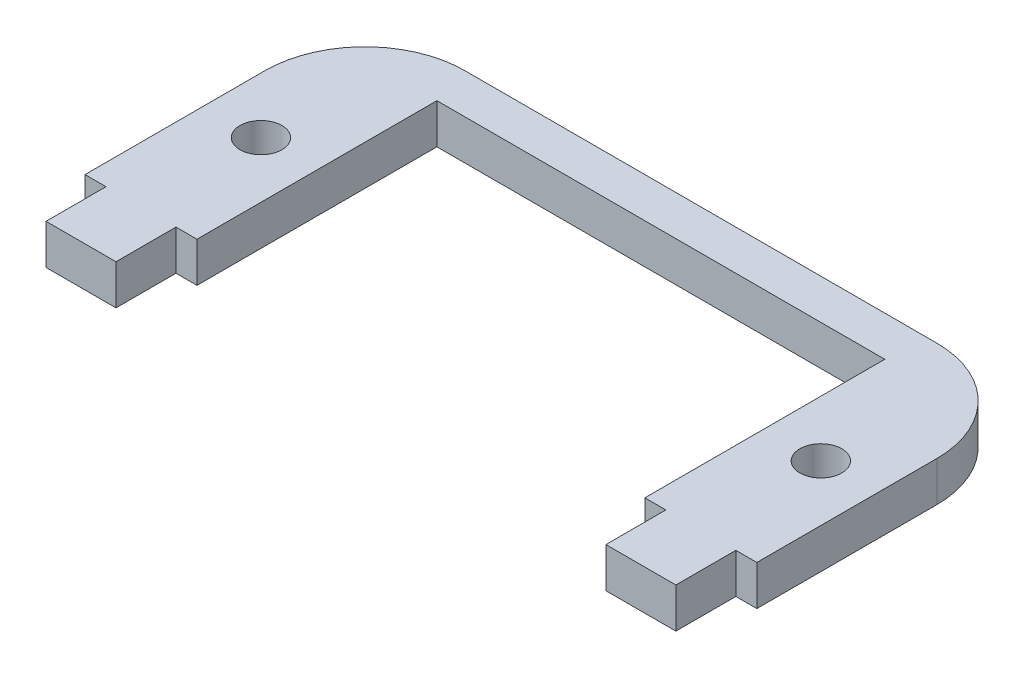
ISO-10303-21;
HEADER;
FILE_DESCRIPTION(('STEP AP214'),'2;1');
FILE_NAME('part.step','',(''),(''),'','','');
FILE_SCHEMA(('AUTOMOTIVE_DESIGN { 1 0 10303 214 1 1 1 1 }'));
ENDSEC;
DATA;
#1=APPLICATION_CONTEXT('core data for automotive mechanical design processes');
#2=APPLICATION_PROTOCOL_DEFINITION('international standard','automotive_design',2000,#1);
#3=PRODUCT_CONTEXT('',#1,'mechanical');
#4=PRODUCT('Part','Part','',(#3));
#5=PRODUCT_RELATED_PRODUCT_CATEGORY('part','',(#4));
#6=PRODUCT_DEFINITION_FORMATION('','',#4);
#7=PRODUCT_DEFINITION_CONTEXT('part definition',#1,'design');
#8=PRODUCT_DEFINITION('design','',#6,#7);
#9=PRODUCT_DEFINITION_SHAPE('','',#8);
#10=(LENGTH_UNIT() NAMED_UNIT(*) SI_UNIT(.MILLI.,.METRE.));
#11=(NAMED_UNIT(*) PLANE_ANGLE_UNIT() SI_UNIT($,.RADIAN.));
#12=(NAMED_UNIT(*) SI_UNIT($,.STERADIAN.) SOLID_ANGLE_UNIT());
#13=UNCERTAINTY_MEASURE_WITH_UNIT(LENGTH_MEASURE(1.E-05),#10,'distance_accuracy_value','');
#14=(GEOMETRIC_REPRESENTATION_CONTEXT(3) GLOBAL_UNCERTAINTY_ASSIGNED_CONTEXT((#13)) GLOBAL_UNIT_ASSIGNED_CONTEXT((#10,
#11,#12)) REPRESENTATION_CONTEXT('',''));
#15=CARTESIAN_POINT('',(0.,0.,0.));
#16=DIRECTION('',(0.,0.,1.));
#17=DIRECTION('',(1.,0.,0.));
#18=AXIS2_PLACEMENT_3D('',#15,#16,#17);
#19=CARTESIAN_POINT('',(16.8,2.,0.));
#20=DIRECTION('',(1.,0.,0.));
#21=DIRECTION('',(0.,0.,-1.));
#22=AXIS2_PLACEMENT_3D('',#19,#20,#21);
#23=PLANE('',#22);
#24=DIRECTION('',(0.,0.,1.));
#25=VECTOR('',#24,1.);
#26=CARTESIAN_POINT('',(16.8,0.,0.));
#27=LINE('',#26,#25);
#28=CARTESIAN_POINT('',(16.8,0.,-8.99999999999996));
#29=VERTEX_POINT('',#28);
#30=CARTESIAN_POINT('',(16.8,0.,0.));
#31=VERTEX_POINT('',#30);
#32=EDGE_CURVE('E195',#29,#31,#27,.T.);
#33=ORIENTED_EDGE('',*,*,#32,.F.);
#34=DIRECTION('',(0.,-1.,0.));
#35=VECTOR('',#34,1.);
#36=CARTESIAN_POINT('',(16.8,2.,-8.99999999999996));
#37=LINE('',#36,#35);
#38=CARTESIAN_POINT('',(16.8,2.,-8.99999999999996));
#39=VERTEX_POINT('',#38);
#40=EDGE_CURVE('E11',#39,#29,#37,.T.);
#41=ORIENTED_EDGE('',*,*,#40,.F.);
#42=DIRECTION('',(0.,0.,1.));
#43=VECTOR('',#42,1.);
#44=CARTESIAN_POINT('',(16.8,2.,0.));
#45=LINE('',#44,#43);
#46=CARTESIAN_POINT('',(16.8,2.,0.));
#47=VERTEX_POINT('',#46);
#48=EDGE_CURVE('E305',#39,#47,#45,.T.);
#49=ORIENTED_EDGE('',*,*,#48,.T.);
#50=DIRECTION('',(0.,-1.,0.));
#51=VECTOR('',#50,1.);
#52=CARTESIAN_POINT('',(16.8,2.,0.));
#53=LINE('',#52,#51);
#54=EDGE_CURVE('E51',#47,#31,#53,.T.);
#55=ORIENTED_EDGE('',*,*,#54,.T.);
#56=EDGE_LOOP('',(#33,#41,#49,#55));
#57=FACE_BOUND('',#56,.T.);
#58=ADVANCED_FACE('F34',(#57),#23,.T.);
#59=CARTESIAN_POINT('',(11.8,2.,-9.));
#60=DIRECTION('',(0.,-1.,0.));
#61=DIRECTION('',(0.,0.,-1.));
#62=AXIS2_PLACEMENT_3D('',#59,#60,#61);
#63=CYLINDRICAL_SURFACE('',#62,5.);
#64=CARTESIAN_POINT('',(11.8,0.,-9.));
#65=DIRECTION('',(0.,1.,0.));
#66=DIRECTION('',(0.,0.,1.));
#67=AXIS2_PLACEMENT_3D('',#64,#65,#66);
#68=CIRCLE('',#67,5.);
#69=CARTESIAN_POINT('',(11.8,0.,-14.));
#70=VERTEX_POINT('',#69);
#71=EDGE_CURVE('E197',#29,#70,#68,.T.);
#72=ORIENTED_EDGE('',*,*,#71,.T.);
#73=DIRECTION('',(0.,-1.,0.));
#74=VECTOR('',#73,1.);
#75=CARTESIAN_POINT('',(11.8,2.,-14.));
#76=LINE('',#75,#74);
#77=CARTESIAN_POINT('',(11.8,2.,-14.));
#78=VERTEX_POINT('',#77);
#79=EDGE_CURVE('E43',#78,#70,#76,.T.);
#80=ORIENTED_EDGE('',*,*,#79,.F.);
#81=CARTESIAN_POINT('',(11.8,2.,-9.));
#82=DIRECTION('',(0.,1.,0.));
#83=DIRECTION('',(0.,0.,1.));
#84=AXIS2_PLACEMENT_3D('',#81,#82,#83);
#85=CIRCLE('',#84,5.);
#86=EDGE_CURVE('E301',#39,#78,#85,.T.);
#87=ORIENTED_EDGE('',*,*,#86,.F.);
#88=ORIENTED_EDGE('',*,*,#40,.T.);
#89=EDGE_LOOP('',(#72,#80,#87,#88));
#90=FACE_BOUND('',#89,.T.);
#91=ADVANCED_FACE('F288',(#90),#63,.T.);
#92=CARTESIAN_POINT('',(0.,2.,-14.));
#93=DIRECTION('',(0.,0.,-1.));
#94=DIRECTION('',(-1.,0.,0.));
#95=AXIS2_PLACEMENT_3D('',#92,#93,#94);
#96=PLANE('',#95);
#97=DIRECTION('',(1.,0.,0.));
#98=VECTOR('',#97,1.);
#99=CARTESIAN_POINT('',(0.,0.,-14.));
#100=LINE('',#99,#98);
#101=CARTESIAN_POINT('',(-11.8,0.,-14.));
#102=VERTEX_POINT('',#101);
#103=EDGE_CURVE('E200',#102,#70,#100,.T.);
#104=ORIENTED_EDGE('',*,*,#103,.F.);
#105=DIRECTION('',(0.,-1.,0.));
#106=VECTOR('',#105,1.);
#107=CARTESIAN_POINT('',(-11.8,2.,-14.));
#108=LINE('',#107,#106);
#109=CARTESIAN_POINT('',(-11.8,2.,-14.));
#110=VERTEX_POINT('',#109);
#111=EDGE_CURVE('E278',#110,#102,#108,.T.);
#112=ORIENTED_EDGE('',*,*,#111,.F.);
#113=DIRECTION('',(1.,0.,0.));
#114=VECTOR('',#113,1.);
#115=CARTESIAN_POINT('',(0.,2.,-14.));
#116=LINE('',#115,#114);
#117=EDGE_CURVE('E285',#110,#78,#116,.T.);
#118=ORIENTED_EDGE('',*,*,#117,.T.);
#119=ORIENTED_EDGE('',*,*,#79,.T.);
#120=EDGE_LOOP('',(#104,#112,#118,#119));
#121=FACE_BOUND('',#120,.T.);
#122=ADVANCED_FACE('F283',(#121),#96,.T.);
#123=CARTESIAN_POINT('',(-11.8,2.,-9.));
#124=DIRECTION('',(0.,-1.,0.));
#125=DIRECTION('',(0.,0.,-1.));
#126=AXIS2_PLACEMENT_3D('',#123,#124,#125);
#127=CYLINDRICAL_SURFACE('',#126,5.);
#128=CARTESIAN_POINT('',(-11.8,0.,-9.));
#129=DIRECTION('',(0.,1.,0.));
#130=DIRECTION('',(0.,0.,1.));
#131=AXIS2_PLACEMENT_3D('',#128,#129,#130);
#132=CIRCLE('',#131,5.);
#133=CARTESIAN_POINT('',(-16.8,0.,-8.99999999999996));
#134=VERTEX_POINT('',#133);
#135=EDGE_CURVE('E203',#134,#102,#132,.F.);
#136=ORIENTED_EDGE('',*,*,#135,.F.);
#137=DIRECTION('',(0.,-1.,0.));
#138=VECTOR('',#137,1.);
#139=CARTESIAN_POINT('',(-16.8,2.,-8.99999999999996));
#140=LINE('',#139,#138);
#141=CARTESIAN_POINT('',(-16.8,2.,-8.99999999999996));
#142=VERTEX_POINT('',#141);
#143=EDGE_CURVE('E276',#142,#134,#140,.T.);
#144=ORIENTED_EDGE('',*,*,#143,.F.);
#145=CARTESIAN_POINT('',(-11.8,2.,-9.));
#146=DIRECTION('',(0.,1.,0.));
#147=DIRECTION('',(0.,0.,1.));
#148=AXIS2_PLACEMENT_3D('',#145,#146,#147);
#149=CIRCLE('',#148,5.);
#150=EDGE_CURVE('E298',#142,#110,#149,.F.);
#151=ORIENTED_EDGE('',*,*,#150,.T.);
#152=ORIENTED_EDGE('',*,*,#111,.T.);
#153=EDGE_LOOP('',(#136,#144,#151,#152));
#154=FACE_BOUND('',#153,.T.);
#155=ADVANCED_FACE('F295',(#154),#127,.T.);
#156=CARTESIAN_POINT('',(-16.8,2.,0.));
#157=DIRECTION('',(-1.,0.,0.));
#158=DIRECTION('',(0.,0.,1.));
#159=AXIS2_PLACEMENT_3D('',#156,#157,#158);
#160=PLANE('',#159);
#161=DIRECTION('',(0.,0.,-1.));
#162=VECTOR('',#161,1.);
#163=CARTESIAN_POINT('',(-16.8,0.,0.));
#164=LINE('',#163,#162);
#165=CARTESIAN_POINT('',(-16.8,0.,0.));
#166=VERTEX_POINT('',#165);
#167=EDGE_CURVE('E206',#166,#134,#164,.T.);
#168=ORIENTED_EDGE('',*,*,#167,.F.);
#169=DIRECTION('',(0.,-1.,0.));
#170=VECTOR('',#169,1.);
#171=CARTESIAN_POINT('',(-16.8,2.,0.));
#172=LINE('',#171,#170);
#173=CARTESIAN_POINT('',(-16.8,2.,0.));
#174=VERTEX_POINT('',#173);
#175=EDGE_CURVE('E274',#174,#166,#172,.T.);
#176=ORIENTED_EDGE('',*,*,#175,.F.);
#177=DIRECTION('',(0.,0.,-1.));
#178=VECTOR('',#177,1.);
#179=CARTESIAN_POINT('',(-16.8,2.,0.));
#180=LINE('',#179,#178);
#181=EDGE_CURVE('E303',#174,#142,#180,.T.);
#182=ORIENTED_EDGE('',*,*,#181,.T.);
#183=ORIENTED_EDGE('',*,*,#143,.T.);
#184=EDGE_LOOP('',(#168,#176,#182,#183));
#185=FACE_BOUND('',#184,.T.);
#186=ADVANCED_FACE('F506',(#185),#160,.T.);
#187=CARTESIAN_POINT('',(0.,2.,0.));
#188=DIRECTION('',(0.,0.,-1.));
#189=DIRECTION('',(-1.,0.,0.));
#190=AXIS2_PLACEMENT_3D('',#187,#188,#189);
#191=PLANE('',#190);
#192=DIRECTION('',(1.,0.,0.));
#193=VECTOR('',#192,1.);
#194=CARTESIAN_POINT('',(0.,0.,0.));
#195=LINE('',#194,#193);
#196=CARTESIAN_POINT('',(-15.75,0.,0.));
#197=VERTEX_POINT('',#196);
#198=EDGE_CURVE('E209',#166,#197,#195,.T.);
#199=ORIENTED_EDGE('',*,*,#198,.T.);
#200=DIRECTION('',(0.,-1.,0.));
#201=VECTOR('',#200,1.);
#202=CARTESIAN_POINT('',(-15.75,2.,0.));
#203=LINE('',#202,#201);
#204=CARTESIAN_POINT('',(-15.75,2.,0.));
#205=VERTEX_POINT('',#204);
#206=EDGE_CURVE('E271',#205,#197,#203,.T.);
#207=ORIENTED_EDGE('',*,*,#206,.F.);
#208=DIRECTION('',(1.,0.,0.));
#209=VECTOR('',#208,1.);
#210=CARTESIAN_POINT('',(0.,2.,0.));
#211=LINE('',#210,#209);
#212=EDGE_CURVE('E310',#174,#205,#211,.T.);
#213=ORIENTED_EDGE('',*,*,#212,.F.);
#214=ORIENTED_EDGE('',*,*,#175,.T.);
#215=EDGE_LOOP('',(#199,#207,#213,#214));
#216=FACE_BOUND('',#215,.T.);
#217=ADVANCED_FACE('F496',(#216),#191,.F.);
#218=CARTESIAN_POINT('',(-15.75,2.,0.));
#219=DIRECTION('',(1.,0.,0.));
#220=DIRECTION('',(0.,0.,-1.));
#221=AXIS2_PLACEMENT_3D('',#218,#219,#220);
#222=PLANE('',#221);
#223=DIRECTION('',(0.,0.,1.));
#224=VECTOR('',#223,1.);
#225=CARTESIAN_POINT('',(-15.75,0.,0.));
#226=LINE('',#225,#224);
#227=CARTESIAN_POINT('',(-15.75,0.,3.));
#228=VERTEX_POINT('',#227);
#229=EDGE_CURVE('E212',#197,#228,#226,.T.);
#230=ORIENTED_EDGE('',*,*,#229,.T.);
#231=DIRECTION('',(0.,-1.,0.));
#232=VECTOR('',#231,1.);
#233=CARTESIAN_POINT('',(-15.75,2.,3.));
#234=LINE('',#233,#232);
#235=CARTESIAN_POINT('',(-15.75,2.,3.));
#236=VERTEX_POINT('',#235);
#237=EDGE_CURVE('E268',#236,#228,#234,.T.);
#238=ORIENTED_EDGE('',*,*,#237,.F.);
#239=DIRECTION('',(0.,0.,1.));
#240=VECTOR('',#239,1.);
#241=CARTESIAN_POINT('',(-15.75,2.,0.));
#242=LINE('',#241,#240);
#243=EDGE_CURVE('E313',#205,#236,#242,.T.);
#244=ORIENTED_EDGE('',*,*,#243,.F.);
#245=ORIENTED_EDGE('',*,*,#206,.T.);
#246=EDGE_LOOP('',(#230,#238,#244,#245));
#247=FACE_BOUND('',#246,.T.);
#248=ADVANCED_FACE('F486',(#247),#222,.F.);
#249=CARTESIAN_POINT('',(0.,2.,3.));
#250=DIRECTION('',(0.,0.,-1.));
#251=DIRECTION('',(-1.,0.,0.));
#252=AXIS2_PLACEMENT_3D('',#249,#250,#251);
#253=PLANE('',#252);
#254=DIRECTION('',(1.,0.,0.));
#255=VECTOR('',#254,1.);
#256=CARTESIAN_POINT('',(0.,0.,3.));
#257=LINE('',#256,#255);
#258=CARTESIAN_POINT('',(-12.25,0.,3.));
#259=VERTEX_POINT('',#258);
#260=EDGE_CURVE('E215',#228,#259,#257,.T.);
#261=ORIENTED_EDGE('',*,*,#260,.T.);
#262=DIRECTION('',(0.,-1.,0.));
#263=VECTOR('',#262,1.);
#264=CARTESIAN_POINT('',(-12.25,2.,3.));
#265=LINE('',#264,#263);
#266=CARTESIAN_POINT('',(-12.25,2.,3.));
#267=VERTEX_POINT('',#266);
#268=EDGE_CURVE('E265',#267,#259,#265,.T.);
#269=ORIENTED_EDGE('',*,*,#268,.F.);
#270=DIRECTION('',(1.,0.,0.));
#271=VECTOR('',#270,1.);
#272=CARTESIAN_POINT('',(0.,2.,3.));
#273=LINE('',#272,#271);
#274=EDGE_CURVE('E316',#236,#267,#273,.T.);
#275=ORIENTED_EDGE('',*,*,#274,.F.);
#276=ORIENTED_EDGE('',*,*,#237,.T.);
#277=EDGE_LOOP('',(#261,#269,#275,#276));
#278=FACE_BOUND('',#277,.T.);
#279=ADVANCED_FACE('F476',(#278),#253,.F.);
#280=CARTESIAN_POINT('',(-12.25,2.,0.));
#281=DIRECTION('',(-1.,0.,0.));
#282=DIRECTION('',(0.,0.,1.));
#283=AXIS2_PLACEMENT_3D('',#280,#281,#282);
#284=PLANE('',#283);
#285=DIRECTION('',(0.,0.,-1.));
#286=VECTOR('',#285,1.);
#287=CARTESIAN_POINT('',(-12.25,0.,0.));
#288=LINE('',#287,#286);
#289=CARTESIAN_POINT('',(-12.25,0.,0.));
#290=VERTEX_POINT('',#289);
#291=EDGE_CURVE('E218',#259,#290,#288,.T.);
#292=ORIENTED_EDGE('',*,*,#291,.T.);
#293=DIRECTION('',(0.,-1.,0.));
#294=VECTOR('',#293,1.);
#295=CARTESIAN_POINT('',(-12.25,2.,0.));
#296=LINE('',#295,#294);
#297=CARTESIAN_POINT('',(-12.25,2.,0.));
#298=VERTEX_POINT('',#297);
#299=EDGE_CURVE('E262',#298,#290,#296,.T.);
#300=ORIENTED_EDGE('',*,*,#299,.F.);
#301=DIRECTION('',(0.,0.,-1.));
#302=VECTOR('',#301,1.);
#303=CARTESIAN_POINT('',(-12.25,2.,0.));
#304=LINE('',#303,#302);
#305=EDGE_CURVE('E319',#267,#298,#304,.T.);
#306=ORIENTED_EDGE('',*,*,#305,.F.);
#307=ORIENTED_EDGE('',*,*,#268,.T.);
#308=EDGE_LOOP('',(#292,#300,#306,#307));
#309=FACE_BOUND('',#308,.T.);
#310=ADVANCED_FACE('F466',(#309),#284,.F.);
#311=CARTESIAN_POINT('',(0.,2.,0.));
#312=DIRECTION('',(0.,0.,-1.));
#313=DIRECTION('',(-1.,0.,0.));
#314=AXIS2_PLACEMENT_3D('',#311,#312,#313);
#315=PLANE('',#314);
#316=DIRECTION('',(1.,0.,0.));
#317=VECTOR('',#316,1.);
#318=CARTESIAN_POINT('',(0.,0.,0.));
#319=LINE('',#318,#317);
#320=CARTESIAN_POINT('',(-11.2,0.,0.));
#321=VERTEX_POINT('',#320);
#322=EDGE_CURVE('E221',#290,#321,#319,.T.);
#323=ORIENTED_EDGE('',*,*,#322,.T.);
#324=DIRECTION('',(0.,-1.,0.));
#325=VECTOR('',#324,1.);
#326=CARTESIAN_POINT('',(-11.2,2.,0.));
#327=LINE('',#326,#325);
#328=CARTESIAN_POINT('',(-11.2,2.,0.));
#329=VERTEX_POINT('',#328);
#330=EDGE_CURVE('E259',#329,#321,#327,.T.);
#331=ORIENTED_EDGE('',*,*,#330,.F.);
#332=DIRECTION('',(1.,0.,0.));
#333=VECTOR('',#332,1.);
#334=CARTESIAN_POINT('',(0.,2.,0.));
#335=LINE('',#334,#333);
#336=EDGE_CURVE('E322',#298,#329,#335,.T.);
#337=ORIENTED_EDGE('',*,*,#336,.F.);
#338=ORIENTED_EDGE('',*,*,#299,.T.);
#339=EDGE_LOOP('',(#323,#331,#337,#338));
#340=FACE_BOUND('',#339,.T.);
#341=ADVANCED_FACE('F456',(#340),#315,.F.);
#342=CARTESIAN_POINT('',(-11.2,2.,0.));
#343=DIRECTION('',(-1.,0.,0.));
#344=DIRECTION('',(0.,0.,1.));
#345=AXIS2_PLACEMENT_3D('',#342,#343,#344);
#346=PLANE('',#345);
#347=DIRECTION('',(0.,0.,-1.));
#348=VECTOR('',#347,1.);
#349=CARTESIAN_POINT('',(-11.2,0.,0.));
#350=LINE('',#349,#348);
#351=CARTESIAN_POINT('',(-11.2,0.,-12.));
#352=VERTEX_POINT('',#351);
#353=EDGE_CURVE('E224',#321,#352,#350,.T.);
#354=ORIENTED_EDGE('',*,*,#353,.T.);
#355=DIRECTION('',(0.,-1.,0.));
#356=VECTOR('',#355,1.);
#357=CARTESIAN_POINT('',(-11.2,2.,-12.));
#358=LINE('',#357,#356);
#359=CARTESIAN_POINT('',(-11.2,2.,-12.));
#360=VERTEX_POINT('',#359);
#361=EDGE_CURVE('E256',#360,#352,#358,.T.);
#362=ORIENTED_EDGE('',*,*,#361,.F.);
#363=DIRECTION('',(0.,0.,-1.));
#364=VECTOR('',#363,1.);
#365=CARTESIAN_POINT('',(-11.2,2.,0.));
#366=LINE('',#365,#364);
#367=EDGE_CURVE('E325',#329,#360,#366,.T.);
#368=ORIENTED_EDGE('',*,*,#367,.F.);
#369=ORIENTED_EDGE('',*,*,#330,.T.);
#370=EDGE_LOOP('',(#354,#362,#368,#369));
#371=FACE_BOUND('',#370,.T.);
#372=ADVANCED_FACE('F446',(#371),#346,.F.);
#373=CARTESIAN_POINT('',(0.,2.,-12.));
#374=DIRECTION('',(0.,0.,-1.));
#375=DIRECTION('',(-1.,0.,0.));
#376=AXIS2_PLACEMENT_3D('',#373,#374,#375);
#377=PLANE('',#376);
#378=DIRECTION('',(1.,0.,0.));
#379=VECTOR('',#378,1.);
#380=CARTESIAN_POINT('',(0.,0.,-12.));
#381=LINE('',#380,#379);
#382=CARTESIAN_POINT('',(11.2,0.,-12.));
#383=VERTEX_POINT('',#382);
#384=EDGE_CURVE('E227',#352,#383,#381,.T.);
#385=ORIENTED_EDGE('',*,*,#384,.T.);
#386=DIRECTION('',(0.,-1.,0.));
#387=VECTOR('',#386,1.);
#388=CARTESIAN_POINT('',(11.2,2.,-12.));
#389=LINE('',#388,#387);
#390=CARTESIAN_POINT('',(11.2,2.,-12.));
#391=VERTEX_POINT('',#390);
#392=EDGE_CURVE('E253',#391,#383,#389,.T.);
#393=ORIENTED_EDGE('',*,*,#392,.F.);
#394=DIRECTION('',(1.,0.,0.));
#395=VECTOR('',#394,1.);
#396=CARTESIAN_POINT('',(0.,2.,-12.));
#397=LINE('',#396,#395);
#398=EDGE_CURVE('E328',#360,#391,#397,.T.);
#399=ORIENTED_EDGE('',*,*,#398,.F.);
#400=ORIENTED_EDGE('',*,*,#361,.T.);
#401=EDGE_LOOP('',(#385,#393,#399,#400));
#402=FACE_BOUND('',#401,.T.);
#403=ADVANCED_FACE('F436',(#402),#377,.F.);
#404=CARTESIAN_POINT('',(11.2,2.,0.));
#405=DIRECTION('',(1.,0.,0.));
#406=DIRECTION('',(0.,0.,-1.));
#407=AXIS2_PLACEMENT_3D('',#404,#405,#406);
#408=PLANE('',#407);
#409=DIRECTION('',(0.,0.,1.));
#410=VECTOR('',#409,1.);
#411=CARTESIAN_POINT('',(11.2,0.,0.));
#412=LINE('',#411,#410);
#413=CARTESIAN_POINT('',(11.2,0.,0.));
#414=VERTEX_POINT('',#413);
#415=EDGE_CURVE('E230',#383,#414,#412,.T.);
#416=ORIENTED_EDGE('',*,*,#415,.T.);
#417=DIRECTION('',(0.,-1.,0.));
#418=VECTOR('',#417,1.);
#419=CARTESIAN_POINT('',(11.2,2.,0.));
#420=LINE('',#419,#418);
#421=CARTESIAN_POINT('',(11.2,2.,0.));
#422=VERTEX_POINT('',#421);
#423=EDGE_CURVE('E251',#422,#414,#420,.T.);
#424=ORIENTED_EDGE('',*,*,#423,.F.);
#425=DIRECTION('',(0.,0.,1.));
#426=VECTOR('',#425,1.);
#427=CARTESIAN_POINT('',(11.2,2.,0.));
#428=LINE('',#427,#426);
#429=EDGE_CURVE('E331',#391,#422,#428,.T.);
#430=ORIENTED_EDGE('',*,*,#429,.F.);
#431=ORIENTED_EDGE('',*,*,#392,.T.);
#432=EDGE_LOOP('',(#416,#424,#430,#431));
#433=FACE_BOUND('',#432,.T.);
#434=ADVANCED_FACE('F426',(#433),#408,.F.);
#435=CARTESIAN_POINT('',(0.,2.,-1.1842378929335E-12));
#436=DIRECTION('',(-1.05735526154777E-13,0.,1.));
#437=DIRECTION('',(1.,0.,1.05735526154777E-13));
#438=AXIS2_PLACEMENT_3D('',#435,#436,#437);
#439=PLANE('',#438);
#440=DIRECTION('',(-1.,0.,-1.05735526154777E-13));
#441=VECTOR('',#440,1.);
#442=CARTESIAN_POINT('',(0.,0.,-1.1842378929335E-12));
#443=LINE('',#442,#441);
#444=CARTESIAN_POINT('',(12.25,0.,1.11022302462516E-13));
#445=VERTEX_POINT('',#444);
#446=EDGE_CURVE('E233',#445,#414,#443,.T.);
#447=ORIENTED_EDGE('',*,*,#446,.F.);
#448=DIRECTION('',(0.,-1.,0.));
#449=VECTOR('',#448,1.);
#450=CARTESIAN_POINT('',(12.25,2.,1.11022302462516E-13));
#451=LINE('',#450,#449);
#452=CARTESIAN_POINT('',(12.25,2.,1.11022302462516E-13));
#453=VERTEX_POINT('',#452);
#454=EDGE_CURVE('E249',#453,#445,#451,.T.);
#455=ORIENTED_EDGE('',*,*,#454,.F.);
#456=DIRECTION('',(-1.,0.,-1.05735526154777E-13));
#457=VECTOR('',#456,1.);
#458=CARTESIAN_POINT('',(0.,2.,-1.1842378929335E-12));
#459=LINE('',#458,#457);
#460=EDGE_CURVE('E333',#453,#422,#459,.T.);
#461=ORIENTED_EDGE('',*,*,#460,.T.);
#462=ORIENTED_EDGE('',*,*,#423,.T.);
#463=EDGE_LOOP('',(#447,#455,#461,#462));
#464=FACE_BOUND('',#463,.T.);
#465=ADVANCED_FACE('F417',(#464),#439,.T.);
#466=CARTESIAN_POINT('',(12.25,2.,0.));
#467=DIRECTION('',(-1.,0.,0.));
#468=DIRECTION('',(0.,0.,1.));
#469=AXIS2_PLACEMENT_3D('',#466,#467,#468);
#470=PLANE('',#469);
#471=DIRECTION('',(0.,0.,-1.));
#472=VECTOR('',#471,1.);
#473=CARTESIAN_POINT('',(12.25,0.,0.));
#474=LINE('',#473,#472);
#475=CARTESIAN_POINT('',(12.25,0.,3.));
#476=VERTEX_POINT('',#475);
#477=EDGE_CURVE('E236',#476,#445,#474,.T.);
#478=ORIENTED_EDGE('',*,*,#477,.F.);
#479=DIRECTION('',(0.,-1.,0.));
#480=VECTOR('',#479,1.);
#481=CARTESIAN_POINT('',(12.25,2.,3.));
#482=LINE('',#481,#480);
#483=CARTESIAN_POINT('',(12.25,2.,3.));
#484=VERTEX_POINT('',#483);
#485=EDGE_CURVE('E170',#484,#476,#482,.T.);
#486=ORIENTED_EDGE('',*,*,#485,.F.);
#487=DIRECTION('',(0.,0.,-1.));
#488=VECTOR('',#487,1.);
#489=CARTESIAN_POINT('',(12.25,2.,0.));
#490=LINE('',#489,#488);
#491=EDGE_CURVE('E181',#484,#453,#490,.T.);
#492=ORIENTED_EDGE('',*,*,#491,.T.);
#493=ORIENTED_EDGE('',*,*,#454,.T.);
#494=EDGE_LOOP('',(#478,#486,#492,#493));
#495=FACE_BOUND('',#494,.T.);
#496=ADVANCED_FACE('F337',(#495),#470,.T.);
#497=CARTESIAN_POINT('',(0.,2.,3.));
#498=DIRECTION('',(0.,0.,1.));
#499=DIRECTION('',(1.,0.,0.));
#500=AXIS2_PLACEMENT_3D('',#497,#498,#499);
#501=PLANE('',#500);
#502=DIRECTION('',(-1.,0.,0.));
#503=VECTOR('',#502,1.);
#504=CARTESIAN_POINT('',(0.,0.,3.));
#505=LINE('',#504,#503);
#506=CARTESIAN_POINT('',(15.75,0.,3.));
#507=VERTEX_POINT('',#506);
#508=EDGE_CURVE('E166',#507,#476,#505,.T.);
#509=ORIENTED_EDGE('',*,*,#508,.F.);
#510=DIRECTION('',(0.,-1.,0.));
#511=VECTOR('',#510,1.);
#512=CARTESIAN_POINT('',(15.75,2.,3.));
#513=LINE('',#512,#511);
#514=CARTESIAN_POINT('',(15.75,2.,3.));
#515=VERTEX_POINT('',#514);
#516=EDGE_CURVE('E161',#515,#507,#513,.T.);
#517=ORIENTED_EDGE('',*,*,#516,.F.);
#518=DIRECTION('',(-1.,0.,0.));
#519=VECTOR('',#518,1.);
#520=CARTESIAN_POINT('',(0.,2.,3.));
#521=LINE('',#520,#519);
#522=EDGE_CURVE('E164',#515,#484,#521,.T.);
#523=ORIENTED_EDGE('',*,*,#522,.T.);
#524=ORIENTED_EDGE('',*,*,#485,.T.);
#525=EDGE_LOOP('',(#509,#517,#523,#524));
#526=FACE_BOUND('',#525,.T.);
#527=ADVANCED_FACE('F163',(#526),#501,.T.);
#528=CARTESIAN_POINT('',(15.75,2.,0.));
#529=DIRECTION('',(1.,0.,0.));
#530=DIRECTION('',(0.,0.,-1.));
#531=AXIS2_PLACEMENT_3D('',#528,#529,#530);
#532=PLANE('',#531);
#533=DIRECTION('',(0.,0.,1.));
#534=VECTOR('',#533,1.);
#535=CARTESIAN_POINT('',(15.75,0.,0.));
#536=LINE('',#535,#534);
#537=CARTESIAN_POINT('',(15.75,0.,1.11022302462516E-13));
#538=VERTEX_POINT('',#537);
#539=EDGE_CURVE('E240',#538,#507,#536,.T.);
#540=ORIENTED_EDGE('',*,*,#539,.F.);
#541=DIRECTION('',(0.,-1.,0.));
#542=VECTOR('',#541,1.);
#543=CARTESIAN_POINT('',(15.75,2.,1.11022302462516E-13));
#544=LINE('',#543,#542);
#545=CARTESIAN_POINT('',(15.75,2.,1.11022302462516E-13));
#546=VERTEX_POINT('',#545);
#547=EDGE_CURVE('E106',#546,#538,#544,.T.);
#548=ORIENTED_EDGE('',*,*,#547,.F.);
#549=DIRECTION('',(0.,0.,1.));
#550=VECTOR('',#549,1.);
#551=CARTESIAN_POINT('',(15.75,2.,0.));
#552=LINE('',#551,#550);
#553=EDGE_CURVE('E178',#546,#515,#552,.T.);
#554=ORIENTED_EDGE('',*,*,#553,.T.);
#555=ORIENTED_EDGE('',*,*,#516,.T.);
#556=EDGE_LOOP('',(#540,#548,#554,#555));
#557=FACE_BOUND('',#556,.T.);
#558=ADVANCED_FACE('F183',(#557),#532,.T.);
#559=CARTESIAN_POINT('',(-14.,2.,-6.));
#560=DIRECTION('',(0.,-1.,0.));
#561=DIRECTION('',(0.,0.,-1.));
#562=AXIS2_PLACEMENT_3D('',#559,#560,#561);
#563=CYLINDRICAL_SURFACE('',#562,1.05);
#564=CARTESIAN_POINT('',(-14.,2.,-6.));
#565=DIRECTION('',(0.,1.,0.));
#566=DIRECTION('',(0.,0.,1.));
#567=AXIS2_PLACEMENT_3D('',#564,#565,#566);
#568=CIRCLE('',#567,1.05);
#569=CARTESIAN_POINT('',(-14.,2.,-4.95));
#570=VERTEX_POINT('',#569);
#571=EDGE_CURVE('E367',#570,#570,#568,.T.);
#572=ORIENTED_EDGE('',*,*,#571,.T.);
#573=EDGE_LOOP('',(#572));
#574=FACE_BOUND('',#573,.T.);
#575=CARTESIAN_POINT('',(-14.,0.,-6.));
#576=DIRECTION('',(0.,1.,0.));
#577=DIRECTION('',(0.,0.,1.));
#578=AXIS2_PLACEMENT_3D('',#575,#576,#577);
#579=CIRCLE('',#578,1.05);
#580=CARTESIAN_POINT('',(-14.,0.,-4.95));
#581=VERTEX_POINT('',#580);
#582=EDGE_CURVE('E192',#581,#581,#579,.T.);
#583=ORIENTED_EDGE('',*,*,#582,.F.);
#584=EDGE_LOOP('',(#583));
#585=FACE_BOUND('',#584,.T.);
#586=ADVANCED_FACE('F348',(#574,#585),#563,.F.);
#587=CARTESIAN_POINT('',(14.,2.,-5.99999999999989));
#588=DIRECTION('',(0.,-1.,0.));
#589=DIRECTION('',(0.,0.,-1.));
#590=AXIS2_PLACEMENT_3D('',#587,#588,#589);
#591=CYLINDRICAL_SURFACE('',#590,1.05);
#592=CARTESIAN_POINT('',(14.,2.,-5.99999999999989));
#593=DIRECTION('',(0.,1.,0.));
#594=DIRECTION('',(0.,0.,1.));
#595=AXIS2_PLACEMENT_3D('',#592,#593,#594);
#596=CIRCLE('',#595,1.05);
#597=CARTESIAN_POINT('',(14.,2.,-4.94999999999989));
#598=VERTEX_POINT('',#597);
#599=EDGE_CURVE('E245',#598,#598,#596,.F.);
#600=ORIENTED_EDGE('',*,*,#599,.F.);
#601=EDGE_LOOP('',(#600));
#602=FACE_BOUND('',#601,.T.);
#603=CARTESIAN_POINT('',(14.,0.,-5.99999999999989));
#604=DIRECTION('',(0.,1.,0.));
#605=DIRECTION('',(0.,0.,1.));
#606=AXIS2_PLACEMENT_3D('',#603,#604,#605);
#607=CIRCLE('',#606,1.05);
#608=CARTESIAN_POINT('',(14.,0.,-4.94999999999989));
#609=VERTEX_POINT('',#608);
#610=EDGE_CURVE('E189',#609,#609,#607,.F.);
#611=ORIENTED_EDGE('',*,*,#610,.T.);
#612=EDGE_LOOP('',(#611));
#613=FACE_BOUND('',#612,.T.);
#614=ADVANCED_FACE('F36',(#602,#613),#591,.F.);
#615=CARTESIAN_POINT('',(0.,2.,1.78664387251308E-12));
#616=DIRECTION('',(1.06388671114322E-13,0.,1.));
#617=DIRECTION('',(1.,0.,-1.06388671114322E-13));
#618=AXIS2_PLACEMENT_3D('',#615,#616,#617);
#619=PLANE('',#618);
#620=DIRECTION('',(-1.,0.,1.06388671114322E-13));
#621=VECTOR('',#620,1.);
#622=CARTESIAN_POINT('',(0.,0.,1.78664387251308E-12));
#623=LINE('',#622,#621);
#624=EDGE_CURVE('E242',#31,#538,#623,.T.);
#625=ORIENTED_EDGE('',*,*,#624,.F.);
#626=ORIENTED_EDGE('',*,*,#54,.F.);
#627=DIRECTION('',(-1.,0.,1.06388671114322E-13));
#628=VECTOR('',#627,1.);
#629=CARTESIAN_POINT('',(0.,2.,1.78664387251308E-12));
#630=LINE('',#629,#628);
#631=EDGE_CURVE('E184',#47,#546,#630,.T.);
#632=ORIENTED_EDGE('',*,*,#631,.T.);
#633=ORIENTED_EDGE('',*,*,#547,.T.);
#634=EDGE_LOOP('',(#625,#626,#632,#633));
#635=FACE_BOUND('',#634,.T.);
#636=ADVANCED_FACE('F339',(#635),#619,.T.);
#637=CARTESIAN_POINT('',(0.,2.,0.));
#638=DIRECTION('',(0.,1.,0.));
#639=DIRECTION('',(0.,0.,1.));
#640=AXIS2_PLACEMENT_3D('',#637,#638,#639);
#641=PLANE('',#640);
#642=ORIENTED_EDGE('',*,*,#599,.T.);
#643=EDGE_LOOP('',(#642));
#644=FACE_BOUND('',#643,.T.);
#645=ORIENTED_EDGE('',*,*,#571,.F.);
#646=EDGE_LOOP('',(#645));
#647=FACE_BOUND('',#646,.T.);
#648=ORIENTED_EDGE('',*,*,#48,.F.);
#649=ORIENTED_EDGE('',*,*,#86,.T.);
#650=ORIENTED_EDGE('',*,*,#117,.F.);
#651=ORIENTED_EDGE('',*,*,#150,.F.);
#652=ORIENTED_EDGE('',*,*,#181,.F.);
#653=ORIENTED_EDGE('',*,*,#212,.T.);
#654=ORIENTED_EDGE('',*,*,#243,.T.);
#655=ORIENTED_EDGE('',*,*,#274,.T.);
#656=ORIENTED_EDGE('',*,*,#305,.T.);
#657=ORIENTED_EDGE('',*,*,#336,.T.);
#658=ORIENTED_EDGE('',*,*,#367,.T.);
#659=ORIENTED_EDGE('',*,*,#398,.T.);
#660=ORIENTED_EDGE('',*,*,#429,.T.);
#661=ORIENTED_EDGE('',*,*,#460,.F.);
#662=ORIENTED_EDGE('',*,*,#491,.F.);
#663=ORIENTED_EDGE('',*,*,#522,.F.);
#664=ORIENTED_EDGE('',*,*,#553,.F.);
#665=ORIENTED_EDGE('',*,*,#631,.F.);
#666=EDGE_LOOP('',(#648,#649,#650,#651,#652,#653,#654,#655,#656,#657,#658,#659,#660,#661,#662,
#663,#664,#665));
#667=FACE_BOUND('',#666,.T.);
#668=ADVANCED_FACE('F176',(#644,#647,#667),#641,.T.);
#669=CARTESIAN_POINT('',(0.,0.,0.));
#670=DIRECTION('',(0.,1.,0.));
#671=DIRECTION('',(0.,0.,1.));
#672=AXIS2_PLACEMENT_3D('',#669,#670,#671);
#673=PLANE('',#672);
#674=ORIENTED_EDGE('',*,*,#610,.F.);
#675=EDGE_LOOP('',(#674));
#676=FACE_BOUND('',#675,.T.);
#677=ORIENTED_EDGE('',*,*,#582,.T.);
#678=EDGE_LOOP('',(#677));
#679=FACE_BOUND('',#678,.T.);
#680=ORIENTED_EDGE('',*,*,#32,.T.);
#681=ORIENTED_EDGE('',*,*,#624,.T.);
#682=ORIENTED_EDGE('',*,*,#539,.T.);
#683=ORIENTED_EDGE('',*,*,#508,.T.);
#684=ORIENTED_EDGE('',*,*,#477,.T.);
#685=ORIENTED_EDGE('',*,*,#446,.T.);
#686=ORIENTED_EDGE('',*,*,#415,.F.);
#687=ORIENTED_EDGE('',*,*,#384,.F.);
#688=ORIENTED_EDGE('',*,*,#353,.F.);
#689=ORIENTED_EDGE('',*,*,#322,.F.);
#690=ORIENTED_EDGE('',*,*,#291,.F.);
#691=ORIENTED_EDGE('',*,*,#260,.F.);
#692=ORIENTED_EDGE('',*,*,#229,.F.);
#693=ORIENTED_EDGE('',*,*,#198,.F.);
#694=ORIENTED_EDGE('',*,*,#167,.T.);
#695=ORIENTED_EDGE('',*,*,#135,.T.);
#696=ORIENTED_EDGE('',*,*,#103,.T.);
#697=ORIENTED_EDGE('',*,*,#71,.F.);
#698=EDGE_LOOP('',(#680,#681,#682,#683,#684,#685,#686,#687,#688,#689,#690,#691,#692,#693,#694,
#695,#696,#697));
#699=FACE_BOUND('',#698,.T.);
#700=ADVANCED_FACE('F290',(#676,#679,#699),#673,.F.);
#701=CLOSED_SHELL('',(#58,#91,#122,#155,#186,#217,#248,#279,#310,#341,#372,#403,#434,#465,#496,
#527,#558,#586,#614,#636,#668,#700));
#702=MANIFOLD_SOLID_BREP('B2',#701);
#703=ADVANCED_BREP_SHAPE_REPRESENTATION('',(#18,#702),#14);
#704=SHAPE_DEFINITION_REPRESENTATION(#9,#703);
ENDSEC;
END-ISO-10303-21;
